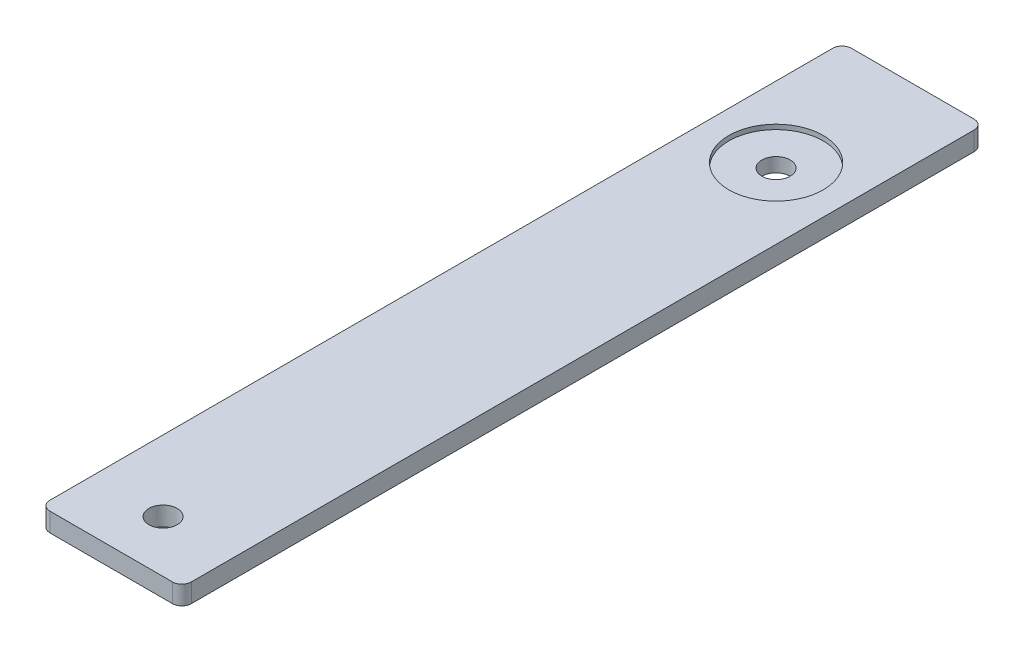
ISO-10303-21;
HEADER;
FILE_DESCRIPTION(('STEP AP214'),'2;1');
FILE_NAME('part.step','',(''),(''),'','','');
FILE_SCHEMA(('AUTOMOTIVE_DESIGN { 1 0 10303 214 1 1 1 1 }'));
ENDSEC;
DATA;
#1=APPLICATION_CONTEXT('core data for automotive mechanical design processes');
#2=APPLICATION_PROTOCOL_DEFINITION('international standard','automotive_design',2000,#1);
#3=PRODUCT_CONTEXT('',#1,'mechanical');
#4=PRODUCT('Part','Part','',(#3));
#5=PRODUCT_RELATED_PRODUCT_CATEGORY('part','',(#4));
#6=PRODUCT_DEFINITION_FORMATION('','',#4);
#7=PRODUCT_DEFINITION_CONTEXT('part definition',#1,'design');
#8=PRODUCT_DEFINITION('design','',#6,#7);
#9=PRODUCT_DEFINITION_SHAPE('','',#8);
#10=(LENGTH_UNIT() NAMED_UNIT(*) SI_UNIT(.MILLI.,.METRE.));
#11=(NAMED_UNIT(*) PLANE_ANGLE_UNIT() SI_UNIT($,.RADIAN.));
#12=(NAMED_UNIT(*) SI_UNIT($,.STERADIAN.) SOLID_ANGLE_UNIT());
#13=UNCERTAINTY_MEASURE_WITH_UNIT(LENGTH_MEASURE(1.E-05),#10,'distance_accuracy_value','');
#14=(GEOMETRIC_REPRESENTATION_CONTEXT(3) GLOBAL_UNCERTAINTY_ASSIGNED_CONTEXT((#13)) GLOBAL_UNIT_ASSIGNED_CONTEXT((#10,
#11,#12)) REPRESENTATION_CONTEXT('',''));
#15=CARTESIAN_POINT('',(0.,0.,0.));
#16=DIRECTION('',(0.,0.,1.));
#17=DIRECTION('',(1.,0.,0.));
#18=AXIS2_PLACEMENT_3D('',#15,#16,#17);
#19=CARTESIAN_POINT('',(7.49999999999998,2.,-70.5));
#20=DIRECTION('',(0.,-1.,0.));
#21=DIRECTION('',(0.,0.,-1.));
#22=AXIS2_PLACEMENT_3D('',#19,#20,#21);
#23=CYLINDRICAL_SURFACE('',#22,1.5);
#24=CARTESIAN_POINT('',(7.49999999999998,0.,-70.5));
#25=DIRECTION('',(0.,1.,0.));
#26=DIRECTION('',(0.,0.,1.));
#27=AXIS2_PLACEMENT_3D('',#24,#25,#26);
#28=CIRCLE('',#27,1.5);
#29=CARTESIAN_POINT('',(7.49999999999998,0.,-69.));
#30=VERTEX_POINT('',#29);
#31=EDGE_CURVE('E132',#30,#30,#28,.T.);
#32=ORIENTED_EDGE('',*,*,#31,.F.);
#33=EDGE_LOOP('',(#32));
#34=FACE_BOUND('',#33,.T.);
#35=CARTESIAN_POINT('',(7.49999999999998,1.5,-70.5));
#36=DIRECTION('',(0.,1.,0.));
#37=DIRECTION('',(0.,0.,1.));
#38=AXIS2_PLACEMENT_3D('',#35,#36,#37);
#39=CIRCLE('',#38,1.5);
#40=CARTESIAN_POINT('',(7.49999999999998,1.5,-69.));
#41=VERTEX_POINT('',#40);
#42=EDGE_CURVE('E138',#41,#41,#39,.T.);
#43=ORIENTED_EDGE('',*,*,#42,.T.);
#44=EDGE_LOOP('',(#43));
#45=FACE_BOUND('',#44,.T.);
#46=ADVANCED_FACE('F33',(#34,#45),#23,.F.);
#47=CARTESIAN_POINT('',(0.,2.,0.));
#48=DIRECTION('',(0.,-1.,0.));
#49=DIRECTION('',(0.,0.,-1.));
#50=AXIS2_PLACEMENT_3D('',#47,#48,#49);
#51=PLANE('',#50);
#52=CARTESIAN_POINT('',(7.49999999999998,2.,-70.5));
#53=DIRECTION('',(0.,1.,0.));
#54=DIRECTION('',(0.,0.,1.));
#55=AXIS2_PLACEMENT_3D('',#52,#53,#54);
#56=CIRCLE('',#55,5.);
#57=CARTESIAN_POINT('',(7.49999999999998,2.,-65.5));
#58=VERTEX_POINT('',#57);
#59=EDGE_CURVE('E189',#58,#58,#56,.T.);
#60=ORIENTED_EDGE('',*,*,#59,.F.);
#61=EDGE_LOOP('',(#60));
#62=FACE_BOUND('',#61,.T.);
#63=DIRECTION('',(0.,0.,1.));
#64=VECTOR('',#63,1.);
#65=CARTESIAN_POINT('',(0.,2.,0.));
#66=LINE('',#65,#64);
#67=CARTESIAN_POINT('',(0.,2.,-84.));
#68=VERTEX_POINT('',#67);
#69=CARTESIAN_POINT('',(0.,2.,-1.));
#70=VERTEX_POINT('',#69);
#71=EDGE_CURVE('E137',#68,#70,#66,.T.);
#72=ORIENTED_EDGE('',*,*,#71,.T.);
#73=CARTESIAN_POINT('',(1.,2.,-1.));
#74=DIRECTION('',(0.,-1.,0.));
#75=DIRECTION('',(0.,0.,-1.));
#76=AXIS2_PLACEMENT_3D('',#73,#74,#75);
#77=CIRCLE('',#76,1.);
#78=CARTESIAN_POINT('',(0.999999999999999,2.,0.));
#79=VERTEX_POINT('',#78);
#80=EDGE_CURVE('E157',#70,#79,#77,.F.);
#81=ORIENTED_EDGE('',*,*,#80,.T.);
#82=DIRECTION('',(1.,0.,0.));
#83=VECTOR('',#82,1.);
#84=CARTESIAN_POINT('',(0.,2.,0.));
#85=LINE('',#84,#83);
#86=CARTESIAN_POINT('',(14.,2.,0.));
#87=VERTEX_POINT('',#86);
#88=EDGE_CURVE('E119',#79,#87,#85,.T.);
#89=ORIENTED_EDGE('',*,*,#88,.T.);
#90=CARTESIAN_POINT('',(14.,2.,-1.));
#91=DIRECTION('',(0.,-1.,0.));
#92=DIRECTION('',(0.,0.,-1.));
#93=AXIS2_PLACEMENT_3D('',#90,#91,#92);
#94=CIRCLE('',#93,1.);
#95=CARTESIAN_POINT('',(15.,2.,-1.));
#96=VERTEX_POINT('',#95);
#97=EDGE_CURVE('E155',#87,#96,#94,.F.);
#98=ORIENTED_EDGE('',*,*,#97,.T.);
#99=DIRECTION('',(0.,0.,-1.));
#100=VECTOR('',#99,1.);
#101=CARTESIAN_POINT('',(15.,2.,0.));
#102=LINE('',#101,#100);
#103=CARTESIAN_POINT('',(15.,2.,-84.));
#104=VERTEX_POINT('',#103);
#105=EDGE_CURVE('E168',#96,#104,#102,.T.);
#106=ORIENTED_EDGE('',*,*,#105,.T.);
#107=CARTESIAN_POINT('',(14.,2.,-84.));
#108=DIRECTION('',(0.,-1.,0.));
#109=DIRECTION('',(0.,0.,-1.));
#110=AXIS2_PLACEMENT_3D('',#107,#108,#109);
#111=CIRCLE('',#110,1.);
#112=CARTESIAN_POINT('',(14.,2.,-85.));
#113=VERTEX_POINT('',#112);
#114=EDGE_CURVE('E54',#104,#113,#111,.F.);
#115=ORIENTED_EDGE('',*,*,#114,.T.);
#116=DIRECTION('',(-1.,0.,0.));
#117=VECTOR('',#116,1.);
#118=CARTESIAN_POINT('',(0.,2.,-85.));
#119=LINE('',#118,#117);
#120=CARTESIAN_POINT('',(0.999999999999984,2.,-85.));
#121=VERTEX_POINT('',#120);
#122=EDGE_CURVE('E143',#113,#121,#119,.T.);
#123=ORIENTED_EDGE('',*,*,#122,.T.);
#124=CARTESIAN_POINT('',(0.999999999999985,2.,-84.));
#125=DIRECTION('',(0.,-1.,0.));
#126=DIRECTION('',(0.,0.,-1.));
#127=AXIS2_PLACEMENT_3D('',#124,#125,#126);
#128=CIRCLE('',#127,1.);
#129=EDGE_CURVE('E152',#121,#68,#128,.F.);
#130=ORIENTED_EDGE('',*,*,#129,.T.);
#131=EDGE_LOOP('',(#72,#81,#89,#98,#106,#115,#123,#130));
#132=FACE_BOUND('',#131,.T.);
#133=CARTESIAN_POINT('',(7.49999999999999,2.,-5.5));
#134=DIRECTION('',(0.,1.,0.));
#135=DIRECTION('',(0.,0.,1.));
#136=AXIS2_PLACEMENT_3D('',#133,#134,#135);
#137=CIRCLE('',#136,1.5);
#138=CARTESIAN_POINT('',(7.49999999999999,2.,-4.));
#139=VERTEX_POINT('',#138);
#140=EDGE_CURVE('E184',#139,#139,#137,.T.);
#141=ORIENTED_EDGE('',*,*,#140,.F.);
#142=EDGE_LOOP('',(#141));
#143=FACE_BOUND('',#142,.T.);
#144=ADVANCED_FACE('F204',(#62,#132,#143),#51,.F.);
#145=CARTESIAN_POINT('',(0.,0.,0.));
#146=DIRECTION('',(0.,-1.,0.));
#147=DIRECTION('',(0.,0.,-1.));
#148=AXIS2_PLACEMENT_3D('',#145,#146,#147);
#149=PLANE('',#148);
#150=ORIENTED_EDGE('',*,*,#31,.T.);
#151=EDGE_LOOP('',(#150));
#152=FACE_BOUND('',#151,.T.);
#153=DIRECTION('',(1.,0.,0.));
#154=VECTOR('',#153,1.);
#155=CARTESIAN_POINT('',(0.,0.,0.));
#156=LINE('',#155,#154);
#157=CARTESIAN_POINT('',(0.999999999999999,0.,0.));
#158=VERTEX_POINT('',#157);
#159=CARTESIAN_POINT('',(14.,0.,0.));
#160=VERTEX_POINT('',#159);
#161=EDGE_CURVE('E116',#158,#160,#156,.T.);
#162=ORIENTED_EDGE('',*,*,#161,.F.);
#163=CARTESIAN_POINT('',(1.,0.,-1.));
#164=DIRECTION('',(0.,-1.,0.));
#165=DIRECTION('',(0.,0.,-1.));
#166=AXIS2_PLACEMENT_3D('',#163,#164,#165);
#167=CIRCLE('',#166,1.);
#168=CARTESIAN_POINT('',(0.,0.,-1.));
#169=VERTEX_POINT('',#168);
#170=EDGE_CURVE('E99',#158,#169,#167,.T.);
#171=ORIENTED_EDGE('',*,*,#170,.T.);
#172=DIRECTION('',(0.,0.,1.));
#173=VECTOR('',#172,1.);
#174=CARTESIAN_POINT('',(0.,0.,0.));
#175=LINE('',#174,#173);
#176=CARTESIAN_POINT('',(0.,0.,-84.));
#177=VERTEX_POINT('',#176);
#178=EDGE_CURVE('E127',#177,#169,#175,.T.);
#179=ORIENTED_EDGE('',*,*,#178,.F.);
#180=CARTESIAN_POINT('',(0.999999999999985,0.,-84.));
#181=DIRECTION('',(0.,-1.,0.));
#182=DIRECTION('',(0.,0.,-1.));
#183=AXIS2_PLACEMENT_3D('',#180,#181,#182);
#184=CIRCLE('',#183,1.);
#185=CARTESIAN_POINT('',(0.999999999999984,0.,-85.));
#186=VERTEX_POINT('',#185);
#187=EDGE_CURVE('E120',#177,#186,#184,.T.);
#188=ORIENTED_EDGE('',*,*,#187,.T.);
#189=DIRECTION('',(-1.,0.,0.));
#190=VECTOR('',#189,1.);
#191=CARTESIAN_POINT('',(0.,0.,-85.));
#192=LINE('',#191,#190);
#193=CARTESIAN_POINT('',(14.,0.,-85.));
#194=VERTEX_POINT('',#193);
#195=EDGE_CURVE('E130',#194,#186,#192,.T.);
#196=ORIENTED_EDGE('',*,*,#195,.F.);
#197=CARTESIAN_POINT('',(14.,0.,-84.));
#198=DIRECTION('',(0.,-1.,0.));
#199=DIRECTION('',(0.,0.,-1.));
#200=AXIS2_PLACEMENT_3D('',#197,#198,#199);
#201=CIRCLE('',#200,1.);
#202=CARTESIAN_POINT('',(15.,0.,-84.));
#203=VERTEX_POINT('',#202);
#204=EDGE_CURVE('E146',#194,#203,#201,.T.);
#205=ORIENTED_EDGE('',*,*,#204,.T.);
#206=DIRECTION('',(0.,0.,-1.));
#207=VECTOR('',#206,1.);
#208=CARTESIAN_POINT('',(15.,0.,0.));
#209=LINE('',#208,#207);
#210=CARTESIAN_POINT('',(15.,0.,-1.));
#211=VERTEX_POINT('',#210);
#212=EDGE_CURVE('E126',#211,#203,#209,.T.);
#213=ORIENTED_EDGE('',*,*,#212,.F.);
#214=CARTESIAN_POINT('',(14.,0.,-1.));
#215=DIRECTION('',(0.,-1.,0.));
#216=DIRECTION('',(0.,0.,-1.));
#217=AXIS2_PLACEMENT_3D('',#214,#215,#216);
#218=CIRCLE('',#217,1.);
#219=EDGE_CURVE('E110',#211,#160,#218,.T.);
#220=ORIENTED_EDGE('',*,*,#219,.T.);
#221=EDGE_LOOP('',(#162,#171,#179,#188,#196,#205,#213,#220));
#222=FACE_BOUND('',#221,.T.);
#223=CARTESIAN_POINT('',(7.49999999999999,0.,-5.5));
#224=DIRECTION('',(0.,1.,0.));
#225=DIRECTION('',(0.,0.,1.));
#226=AXIS2_PLACEMENT_3D('',#223,#224,#225);
#227=CIRCLE('',#226,1.5);
#228=CARTESIAN_POINT('',(7.49999999999999,0.,-4.));
#229=VERTEX_POINT('',#228);
#230=EDGE_CURVE('E141',#229,#229,#227,.T.);
#231=ORIENTED_EDGE('',*,*,#230,.T.);
#232=EDGE_LOOP('',(#231));
#233=FACE_BOUND('',#232,.T.);
#234=ADVANCED_FACE('F123',(#152,#222,#233),#149,.T.);
#235=CARTESIAN_POINT('',(0.,2.,0.));
#236=DIRECTION('',(1.,0.,0.));
#237=DIRECTION('',(0.,0.,-1.));
#238=AXIS2_PLACEMENT_3D('',#235,#236,#237);
#239=PLANE('',#238);
#240=ORIENTED_EDGE('',*,*,#178,.T.);
#241=DIRECTION('',(0.,-1.,0.));
#242=VECTOR('',#241,1.);
#243=CARTESIAN_POINT('',(0.,2.,-1.));
#244=LINE('',#243,#242);
#245=EDGE_CURVE('E104',#169,#70,#244,.F.);
#246=ORIENTED_EDGE('',*,*,#245,.T.);
#247=ORIENTED_EDGE('',*,*,#71,.F.);
#248=DIRECTION('',(0.,-1.,0.));
#249=VECTOR('',#248,1.);
#250=CARTESIAN_POINT('',(0.,2.,-84.));
#251=LINE('',#250,#249);
#252=EDGE_CURVE('E109',#68,#177,#251,.T.);
#253=ORIENTED_EDGE('',*,*,#252,.T.);
#254=EDGE_LOOP('',(#240,#246,#247,#253));
#255=FACE_BOUND('',#254,.T.);
#256=ADVANCED_FACE('F216',(#255),#239,.F.);
#257=CARTESIAN_POINT('',(0.,2.,0.));
#258=DIRECTION('',(0.,0.,-1.));
#259=DIRECTION('',(-1.,0.,0.));
#260=AXIS2_PLACEMENT_3D('',#257,#258,#259);
#261=PLANE('',#260);
#262=ORIENTED_EDGE('',*,*,#88,.F.);
#263=DIRECTION('',(0.,-1.,0.));
#264=VECTOR('',#263,1.);
#265=CARTESIAN_POINT('',(1.,2.,0.));
#266=LINE('',#265,#264);
#267=EDGE_CURVE('E103',#79,#158,#266,.T.);
#268=ORIENTED_EDGE('',*,*,#267,.T.);
#269=ORIENTED_EDGE('',*,*,#161,.T.);
#270=DIRECTION('',(0.,-1.,0.));
#271=VECTOR('',#270,1.);
#272=CARTESIAN_POINT('',(14.,2.,0.));
#273=LINE('',#272,#271);
#274=EDGE_CURVE('E121',#160,#87,#273,.F.);
#275=ORIENTED_EDGE('',*,*,#274,.T.);
#276=EDGE_LOOP('',(#262,#268,#269,#275));
#277=FACE_BOUND('',#276,.T.);
#278=ADVANCED_FACE('F115',(#277),#261,.F.);
#279=CARTESIAN_POINT('',(15.,2.,0.));
#280=DIRECTION('',(-1.,0.,0.));
#281=DIRECTION('',(0.,0.,1.));
#282=AXIS2_PLACEMENT_3D('',#279,#280,#281);
#283=PLANE('',#282);
#284=ORIENTED_EDGE('',*,*,#105,.F.);
#285=DIRECTION('',(0.,-1.,0.));
#286=VECTOR('',#285,1.);
#287=CARTESIAN_POINT('',(15.,2.,-1.));
#288=LINE('',#287,#286);
#289=EDGE_CURVE('E161',#96,#211,#288,.T.);
#290=ORIENTED_EDGE('',*,*,#289,.T.);
#291=ORIENTED_EDGE('',*,*,#212,.T.);
#292=DIRECTION('',(0.,-1.,0.));
#293=VECTOR('',#292,1.);
#294=CARTESIAN_POINT('',(15.,2.,-84.));
#295=LINE('',#294,#293);
#296=EDGE_CURVE('E159',#203,#104,#295,.F.);
#297=ORIENTED_EDGE('',*,*,#296,.T.);
#298=EDGE_LOOP('',(#284,#290,#291,#297));
#299=FACE_BOUND('',#298,.T.);
#300=ADVANCED_FACE('F166',(#299),#283,.F.);
#301=CARTESIAN_POINT('',(0.,2.,-85.));
#302=DIRECTION('',(0.,0.,1.));
#303=DIRECTION('',(1.,0.,0.));
#304=AXIS2_PLACEMENT_3D('',#301,#302,#303);
#305=PLANE('',#304);
#306=ORIENTED_EDGE('',*,*,#122,.F.);
#307=DIRECTION('',(0.,-1.,0.));
#308=VECTOR('',#307,1.);
#309=CARTESIAN_POINT('',(14.,2.,-85.));
#310=LINE('',#309,#308);
#311=EDGE_CURVE('E11',#113,#194,#310,.T.);
#312=ORIENTED_EDGE('',*,*,#311,.T.);
#313=ORIENTED_EDGE('',*,*,#195,.T.);
#314=DIRECTION('',(0.,-1.,0.));
#315=VECTOR('',#314,1.);
#316=CARTESIAN_POINT('',(0.999999999999985,2.,-85.));
#317=LINE('',#316,#315);
#318=EDGE_CURVE('E41',#186,#121,#317,.F.);
#319=ORIENTED_EDGE('',*,*,#318,.T.);
#320=EDGE_LOOP('',(#306,#312,#313,#319));
#321=FACE_BOUND('',#320,.T.);
#322=ADVANCED_FACE('F175',(#321),#305,.F.);
#323=CARTESIAN_POINT('',(7.49999999999999,2.,-5.5));
#324=DIRECTION('',(0.,-1.,0.));
#325=DIRECTION('',(0.,0.,-1.));
#326=AXIS2_PLACEMENT_3D('',#323,#324,#325);
#327=CYLINDRICAL_SURFACE('',#326,1.5);
#328=ORIENTED_EDGE('',*,*,#140,.T.);
#329=EDGE_LOOP('',(#328));
#330=FACE_BOUND('',#329,.T.);
#331=ORIENTED_EDGE('',*,*,#230,.F.);
#332=EDGE_LOOP('',(#331));
#333=FACE_BOUND('',#332,.T.);
#334=ADVANCED_FACE('F200',(#330,#333),#327,.F.);
#335=CARTESIAN_POINT('',(7.49999999999998,1.5,-70.5));
#336=DIRECTION('',(0.,1.,0.));
#337=DIRECTION('',(0.,0.,1.));
#338=AXIS2_PLACEMENT_3D('',#335,#336,#337);
#339=CYLINDRICAL_SURFACE('',#338,5.);
#340=CARTESIAN_POINT('',(7.49999999999998,1.5,-70.5));
#341=DIRECTION('',(0.,1.,0.));
#342=DIRECTION('',(0.,0.,1.));
#343=AXIS2_PLACEMENT_3D('',#340,#341,#342);
#344=CIRCLE('',#343,5.);
#345=CARTESIAN_POINT('',(7.49999999999998,1.5,-65.5));
#346=VERTEX_POINT('',#345);
#347=EDGE_CURVE('E142',#346,#346,#344,.T.);
#348=ORIENTED_EDGE('',*,*,#347,.F.);
#349=EDGE_LOOP('',(#348));
#350=FACE_BOUND('',#349,.T.);
#351=ORIENTED_EDGE('',*,*,#59,.T.);
#352=EDGE_LOOP('',(#351));
#353=FACE_BOUND('',#352,.T.);
#354=ADVANCED_FACE('F197',(#350,#353),#339,.F.);
#355=CARTESIAN_POINT('',(7.49999999999998,1.5,-70.5));
#356=DIRECTION('',(0.,1.,0.));
#357=DIRECTION('',(0.,0.,1.));
#358=AXIS2_PLACEMENT_3D('',#355,#356,#357);
#359=PLANE('',#358);
#360=ORIENTED_EDGE('',*,*,#42,.F.);
#361=EDGE_LOOP('',(#360));
#362=FACE_BOUND('',#361,.T.);
#363=ORIENTED_EDGE('',*,*,#347,.T.);
#364=EDGE_LOOP('',(#363));
#365=FACE_BOUND('',#364,.T.);
#366=ADVANCED_FACE('F195',(#362,#365),#359,.T.);
#367=CARTESIAN_POINT('',(1.,2.,-1.));
#368=DIRECTION('',(0.,-1.,0.));
#369=DIRECTION('',(0.,0.,-1.));
#370=AXIS2_PLACEMENT_3D('',#367,#368,#369);
#371=CYLINDRICAL_SURFACE('',#370,1.);
#372=ORIENTED_EDGE('',*,*,#80,.F.);
#373=ORIENTED_EDGE('',*,*,#245,.F.);
#374=ORIENTED_EDGE('',*,*,#170,.F.);
#375=ORIENTED_EDGE('',*,*,#267,.F.);
#376=EDGE_LOOP('',(#372,#373,#374,#375));
#377=FACE_BOUND('',#376,.T.);
#378=ADVANCED_FACE('F102',(#377),#371,.T.);
#379=CARTESIAN_POINT('',(14.,2.,-1.));
#380=DIRECTION('',(0.,-1.,0.));
#381=DIRECTION('',(0.,0.,-1.));
#382=AXIS2_PLACEMENT_3D('',#379,#380,#381);
#383=CYLINDRICAL_SURFACE('',#382,1.);
#384=ORIENTED_EDGE('',*,*,#97,.F.);
#385=ORIENTED_EDGE('',*,*,#274,.F.);
#386=ORIENTED_EDGE('',*,*,#219,.F.);
#387=ORIENTED_EDGE('',*,*,#289,.F.);
#388=EDGE_LOOP('',(#384,#385,#386,#387));
#389=FACE_BOUND('',#388,.T.);
#390=ADVANCED_FACE('F239',(#389),#383,.T.);
#391=CARTESIAN_POINT('',(14.,2.,-84.));
#392=DIRECTION('',(0.,-1.,0.));
#393=DIRECTION('',(0.,0.,-1.));
#394=AXIS2_PLACEMENT_3D('',#391,#392,#393);
#395=CYLINDRICAL_SURFACE('',#394,1.);
#396=ORIENTED_EDGE('',*,*,#114,.F.);
#397=ORIENTED_EDGE('',*,*,#296,.F.);
#398=ORIENTED_EDGE('',*,*,#204,.F.);
#399=ORIENTED_EDGE('',*,*,#311,.F.);
#400=EDGE_LOOP('',(#396,#397,#398,#399));
#401=FACE_BOUND('',#400,.T.);
#402=ADVANCED_FACE('F174',(#401),#395,.T.);
#403=CARTESIAN_POINT('',(0.999999999999985,2.,-84.));
#404=DIRECTION('',(0.,-1.,0.));
#405=DIRECTION('',(0.,0.,-1.));
#406=AXIS2_PLACEMENT_3D('',#403,#404,#405);
#407=CYLINDRICAL_SURFACE('',#406,1.);
#408=ORIENTED_EDGE('',*,*,#129,.F.);
#409=ORIENTED_EDGE('',*,*,#318,.F.);
#410=ORIENTED_EDGE('',*,*,#187,.F.);
#411=ORIENTED_EDGE('',*,*,#252,.F.);
#412=EDGE_LOOP('',(#408,#409,#410,#411));
#413=FACE_BOUND('',#412,.T.);
#414=ADVANCED_FACE('F35',(#413),#407,.T.);
#415=CLOSED_SHELL('',(#46,#144,#234,#256,#278,#300,#322,#334,#354,#366,#378,#390,#402,#414));
#416=MANIFOLD_SOLID_BREP('B2',#415);
#417=ADVANCED_BREP_SHAPE_REPRESENTATION('',(#18,#416),#14);
#418=SHAPE_DEFINITION_REPRESENTATION(#9,#417);
ENDSEC;
END-ISO-10303-21;
